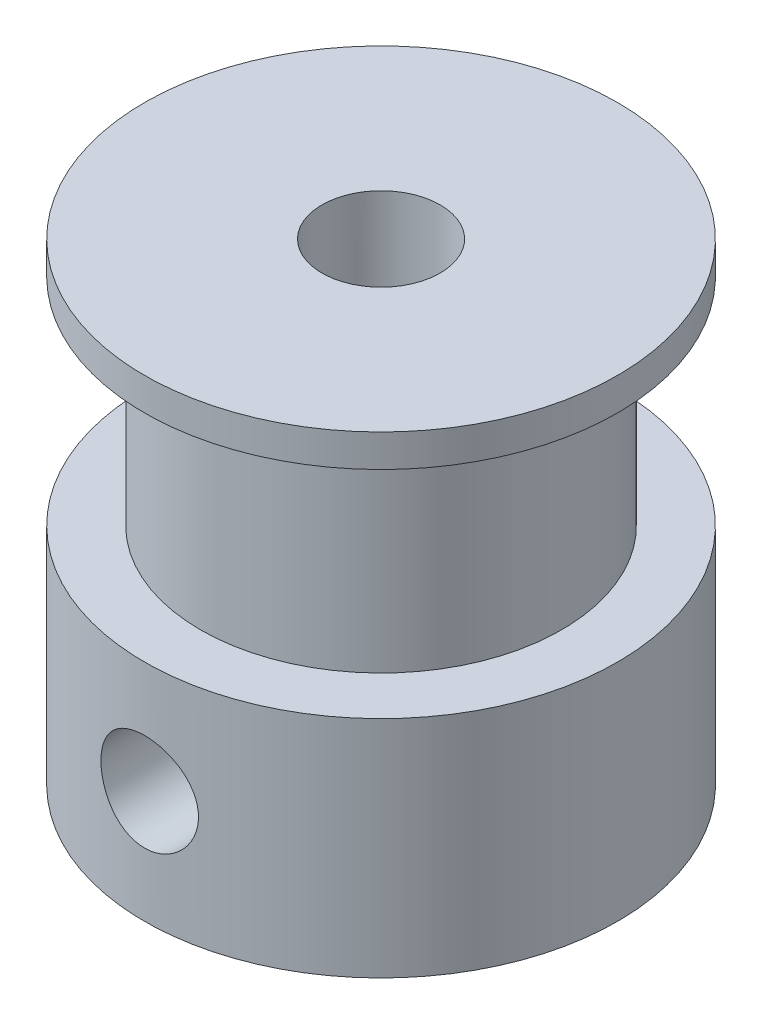
ISO-10303-21;
HEADER;
FILE_DESCRIPTION(('STEP AP214'),'2;1');
FILE_NAME('part.step','',(''),(''),'','','');
FILE_SCHEMA(('AUTOMOTIVE_DESIGN { 1 0 10303 214 1 1 1 1 }'));
ENDSEC;
DATA;
#1=APPLICATION_CONTEXT('core data for automotive mechanical design processes');
#2=APPLICATION_PROTOCOL_DEFINITION('international standard','automotive_design',2000,#1);
#3=PRODUCT_CONTEXT('',#1,'mechanical');
#4=PRODUCT('Part','Part','',(#3));
#5=PRODUCT_RELATED_PRODUCT_CATEGORY('part','',(#4));
#6=PRODUCT_DEFINITION_FORMATION('','',#4);
#7=PRODUCT_DEFINITION_CONTEXT('part definition',#1,'design');
#8=PRODUCT_DEFINITION('design','',#6,#7);
#9=PRODUCT_DEFINITION_SHAPE('','',#8);
#10=(LENGTH_UNIT() NAMED_UNIT(*) SI_UNIT(.MILLI.,.METRE.));
#11=(NAMED_UNIT(*) PLANE_ANGLE_UNIT() SI_UNIT($,.RADIAN.));
#12=(NAMED_UNIT(*) SI_UNIT($,.STERADIAN.) SOLID_ANGLE_UNIT());
#13=UNCERTAINTY_MEASURE_WITH_UNIT(LENGTH_MEASURE(1.E-05),#10,'distance_accuracy_value','');
#14=(GEOMETRIC_REPRESENTATION_CONTEXT(3) GLOBAL_UNCERTAINTY_ASSIGNED_CONTEXT((#13)) GLOBAL_UNIT_ASSIGNED_CONTEXT((#10,
#11,#12)) REPRESENTATION_CONTEXT('',''));
#15=CARTESIAN_POINT('',(0.,0.,0.));
#16=DIRECTION('',(0.,0.,1.));
#17=DIRECTION('',(1.,0.,0.));
#18=AXIS2_PLACEMENT_3D('',#15,#16,#17);
#19=CARTESIAN_POINT('',(0.,0.,0.));
#20=DIRECTION('',(0.,-1.,0.));
#21=DIRECTION('',(0.,0.,-1.));
#22=AXIS2_PLACEMENT_3D('',#19,#20,#21);
#23=CYLINDRICAL_SURFACE('',#22,2.);
#24=CARTESIAN_POINT('',(-1.13026545554573,3.8,-1.65));
#25=CARTESIAN_POINT('',(-1.13028415076943,3.85926051537599,-1.64999227227883));
#26=CARTESIAN_POINT('',(-1.13502591142918,3.918585815563,-1.64676945248434));
#27=CARTESIAN_POINT('',(-1.15304173822756,4.03532638305221,-1.63419783551532));
#28=CARTESIAN_POINT('',(-1.16634388013207,4.09273470909952,-1.62482887868409));
#29=CARTESIAN_POINT('',(-1.20547690344032,4.22556274774616,-1.59612095717539));
#30=CARTESIAN_POINT('',(-1.23414234516333,4.2995945923382,-1.57435275047642));
#31=CARTESIAN_POINT('',(-1.29806621774548,4.44149275037572,-1.52208388617206));
#32=CARTESIAN_POINT('',(-1.33334547250337,4.50933855545449,-1.49155548099388));
#33=CARTESIAN_POINT('',(-1.42222300183614,4.66663285325792,-1.40797644659791));
#34=CARTESIAN_POINT('',(-1.47726773224047,4.75311076059239,-1.35085848431609));
#35=CARTESIAN_POINT('',(-1.5861371945003,4.91436350952067,-1.22121270441164));
#36=CARTESIAN_POINT('',(-1.63996300247571,4.98914904795033,-1.14869911651516));
#37=CARTESIAN_POINT('',(-1.73075576686599,5.11121982813182,-1.00505161338099));
#38=CARTESIAN_POINT('',(-1.76889826123069,5.1609880474015,-0.936780316579709));
#39=CARTESIAN_POINT('',(-1.83869568986702,5.2505478516896,-0.791011905073765));
#40=CARTESIAN_POINT('',(-1.87036099924608,5.29035541481951,-0.713529863949439));
#41=CARTESIAN_POINT('',(-1.92003863633826,5.35219982846454,-0.564391365535739));
#42=CARTESIAN_POINT('',(-1.93945690667581,5.37610735426846,-0.493984239207893));
#43=CARTESIAN_POINT('',(-1.97070722627486,5.4144072664903,-0.348996465230121));
#44=CARTESIAN_POINT('',(-1.98254357394106,5.42880504439548,-0.274418208435071));
#45=CARTESIAN_POINT('',(-1.99768401570965,5.44720039950701,-0.122807668158569));
#46=CARTESIAN_POINT('',(-2.00095397094506,5.45115636437384,-0.0457668005088466));
#47=CARTESIAN_POINT('',(-1.99856235369188,5.44825734582013,0.1079694456252));
#48=CARTESIAN_POINT('',(-1.99290098652025,5.44140261092045,0.184664832010945));
#49=CARTESIAN_POINT('',(-1.97379671000669,5.41815118932709,0.3304385940908));
#50=CARTESIAN_POINT('',(-1.96087391985351,5.40239193125911,0.399690594450734));
#51=CARTESIAN_POINT('',(-1.92857757949744,5.36270411240553,0.534208242042524));
#52=CARTESIAN_POINT('',(-1.9092023171223,5.33877338326629,0.599472825762324));
#53=CARTESIAN_POINT('',(-1.86320785456576,5.28133933721514,0.730548464404965));
#54=CARTESIAN_POINT('',(-1.83609858158257,5.24717524760406,0.795894584928092));
#55=CARTESIAN_POINT('',(-1.77719394559291,5.17166899902193,0.919948391449341));
#56=CARTESIAN_POINT('',(-1.74539658935479,5.13032378551565,0.978653234921042));
#57=CARTESIAN_POINT('',(-1.67171963108471,5.03223815911382,1.10064828175204));
#58=CARTESIAN_POINT('',(-1.62911719465582,4.97408350097415,1.16236134200595));
#59=CARTESIAN_POINT('',(-1.54195911034385,4.84981509390737,1.27572706450586));
#60=CARTESIAN_POINT('',(-1.49740051200199,4.78368903987347,1.32736384220259));
#61=CARTESIAN_POINT('',(-1.41010644459443,4.64486141008404,1.41970811861179));
#62=CARTESIAN_POINT('',(-1.36735399521382,4.57226771702631,1.46056171573081));
#63=CARTESIAN_POINT('',(-1.28717415122903,4.41932117956903,1.53167497630218));
#64=CARTESIAN_POINT('',(-1.24973512700426,4.33898594768706,1.56195799486271));
#65=CARTESIAN_POINT('',(-1.1984152588373,4.20138882110026,1.60138777813433));
#66=CARTESIAN_POINT('',(-1.18093929490523,4.1465524002447,1.6142104205928));
#67=CARTESIAN_POINT('',(-1.15299719020701,4.03418814869539,1.63428776772427));
#68=CARTESIAN_POINT('',(-1.14251315468429,3.97666759493909,1.64155669328038));
#69=CARTESIAN_POINT('',(-1.13033953247814,3.85967800061025,1.64996891598047));
#70=CARTESIAN_POINT('',(-1.12872872011397,3.80019620842181,1.65105734680687));
#71=CARTESIAN_POINT('',(-1.13487333460963,3.6819297454341,1.64683678849177));
#72=CARTESIAN_POINT('',(-1.14263832831456,3.62314584859737,1.64152126492285));
#73=CARTESIAN_POINT('',(-1.16815617652571,3.49738797474651,1.62347982180047));
#74=CARTESIAN_POINT('',(-1.18749782996447,3.43092374216045,1.6095596982077));
#75=CARTESIAN_POINT('',(-1.23344854168307,3.30248437475811,1.57462287407046));
#76=CARTESIAN_POINT('',(-1.26008094126549,3.24052448092267,1.5535833287538));
#77=CARTESIAN_POINT('',(-1.33341951279276,3.08780902758391,1.49176915051823));
#78=CARTESIAN_POINT('',(-1.38303507818271,3.00027506187473,1.44653306326051));
#79=CARTESIAN_POINT('',(-1.48453519345396,2.83536695418688,1.34220157598673));
#80=CARTESIAN_POINT('',(-1.53642313229968,2.7580087270396,1.28308485952938));
#81=CARTESIAN_POINT('',(-1.63920566799775,2.61160568199577,1.14907243931511));
#82=CARTESIAN_POINT('',(-1.69001762335199,2.54289907872837,1.07373873685186));
#83=CARTESIAN_POINT('',(-1.78412887954789,2.41897772195684,0.908761283766789));
#84=CARTESIAN_POINT('',(-1.82745006163973,2.36372347309673,0.819160733032883));
#85=CARTESIAN_POINT('',(-1.89053568747178,2.28441263887737,0.656498289867193));
#86=CARTESIAN_POINT('',(-1.9134505711351,2.25598468797621,0.58678471759722));
#87=CARTESIAN_POINT('',(-1.95191365735138,2.20856628267004,0.442272815540217));
#88=CARTESIAN_POINT('',(-1.9674674713755,2.18956863883654,0.367478408864379));
#89=CARTESIAN_POINT('',(-1.990004906352,2.16211062191683,0.214253921939989));
#90=CARTESIAN_POINT('',(-1.99694128043541,2.1537083363002,0.13580622390241));
#91=CARTESIAN_POINT('',(-2.00143235704986,2.14826320041607,-0.0217524751306384));
#92=CARTESIAN_POINT('',(-1.99898891582435,2.1512181025879,-0.100863341794807));
#93=CARTESIAN_POINT('',(-1.98556597861725,2.16752022427639,-0.250369191143564));
#94=CARTESIAN_POINT('',(-1.97532813229727,2.17996465707949,-0.320934275077173));
#95=CARTESIAN_POINT('',(-1.94798026639519,2.21342517154411,-0.458585583525762));
#96=CARTESIAN_POINT('',(-1.93086923617685,2.23444251377738,-0.525671294793426));
#97=CARTESIAN_POINT('',(-1.88971965899813,2.28547626438997,-0.658860742236346));
#98=CARTESIAN_POINT('',(-1.86533788499696,2.31594257904114,-0.724683629772341));
#99=CARTESIAN_POINT('',(-1.81156976407853,2.38411779109453,-0.850229115075157));
#100=CARTESIAN_POINT('',(-1.78218001185953,2.42183161887149,-0.909947517441124));
#101=CARTESIAN_POINT('',(-1.70530487628979,2.52247411472445,-1.04922193468147));
#102=CARTESIAN_POINT('',(-1.65576344975117,2.58896913978808,-1.12507582112121));
#103=CARTESIAN_POINT('',(-1.55334758816822,2.73322626009445,-1.26272785048503));
#104=CARTESIAN_POINT('',(-1.50046569403278,2.81101411289381,-1.32449300754987));
#105=CARTESIAN_POINT('',(-1.40540519120628,2.9630051635957,-1.42433941767243));
#106=CARTESIAN_POINT('',(-1.36293689648538,3.03556470556712,-1.46466250238521));
#107=CARTESIAN_POINT('',(-1.28348372555566,3.18837493885839,-1.53474710964661));
#108=CARTESIAN_POINT('',(-1.24648383149605,3.2686035303686,-1.56453788297914));
#109=CARTESIAN_POINT('',(-1.19546064576473,3.40734324291319,-1.60359748989877));
#110=CARTESIAN_POINT('',(-1.1779352912953,3.46354399346197,-1.61639866033694));
#111=CARTESIAN_POINT('',(-1.15039619318333,3.57866767605502,-1.63611919687715));
#112=CARTESIAN_POINT('',(-1.14035358351031,3.63757920646891,-1.64306117976042));
#113=CARTESIAN_POINT('',(-1.13183426890592,3.73124345779533,-1.64892627372215));
#114=CARTESIAN_POINT('',(-1.13025460661204,3.7656108206252,-1.65000448443602));
#115=CARTESIAN_POINT('',(-1.13026545554573,3.8,-1.65));
#116=B_SPLINE_CURVE_WITH_KNOTS('',3,(#24,#25,#26,#27,#28,#29,#30,#31,#32,#33,#34,#35,#36,#37,
#38,#39,#40,#41,#42,#43,#44,#45,#46,#47,#48,#49,#50,#51,#52,#53,#54,#55,#56,#57,#58,#59,#60,#61,
#62,#63,#64,#65,#66,#67,#68,#69,#70,#71,#72,#73,#74,#75,#76,#77,#78,#79,#80,#81,#82,#83,#84,#85,
#86,#87,#88,#89,#90,#91,#92,#93,#94,#95,#96,#97,#98,#99,#100,#101,#102,#103,#104,#105,#106,#107,
#108,#109,#110,#111,#112,#113,#114,#115),.UNSPECIFIED.,.T.,.F.,(4,2,2,2,2,2,2,2,2,2,2,2,2,2,2,2,
2,2,2,2,2,2,2,2,2,2,2,2,2,2,2,2,2,2,2,2,2,2,2,2,2,2,2,2,2,4),(0.,0.177648530807623,
0.355882691473128,0.601443292499048,0.847790448623785,1.19812833957858,1.54814382224754,
1.82520592846372,2.10182070205136,2.33140490846503,2.5608588416851,2.79122581550894,
3.02158749363795,3.23723550442052,3.45294078334937,3.68777765164435,3.92271465497308,
4.20641290294695,4.49055483092938,4.77062243715899,5.05006727339435,5.2263891737602,
5.40225805582106,5.57968577284946,5.757294685913,5.96793121535144,6.17925014674008,
6.50847192127705,6.83820262620213,7.17830943304657,7.51740532680624,7.75256707833379,
7.98754927206169,8.2238141978469,8.46003236976818,8.67621339934492,8.89242622792675,
9.12113536240786,9.35000063862292,9.68537800220093,10.0215327023829,10.3004679621606,
10.5786223504854,10.7587522694697,10.9381836552402,11.0412740038956),.UNSPECIFIED.);
#117=CARTESIAN_POINT('',(-1.4142135623731,2.95000000000001,1.41421356237309));
#118=VERTEX_POINT('',#117);
#119=CARTESIAN_POINT('',(-1.41421356237344,4.65000000000007,1.41421356237275));
#120=VERTEX_POINT('',#119);
#121=EDGE_CURVE('E47',#118,#120,#116,.T.);
#122=ORIENTED_EDGE('',*,*,#121,.F.);
#123=CARTESIAN_POINT('',(-1.65,3.8,1.13026545554573));
#124=CARTESIAN_POINT('',(-1.64999227227882,3.85926051537599,1.13028415076944));
#125=CARTESIAN_POINT('',(-1.64676945248434,3.918585815563,1.13502591142918));
#126=CARTESIAN_POINT('',(-1.63419783551532,4.03532638305221,1.15304173822756));
#127=CARTESIAN_POINT('',(-1.62482887868409,4.09273470909952,1.16634388013208));
#128=CARTESIAN_POINT('',(-1.59612095717538,4.22556274774616,1.20547690344032));
#129=CARTESIAN_POINT('',(-1.57435275047642,4.2995945923382,1.23414234516333));
#130=CARTESIAN_POINT('',(-1.52208388617206,4.44149275037572,1.29806621774548));
#131=CARTESIAN_POINT('',(-1.49155548099387,4.50933855545449,1.33334547250337));
#132=CARTESIAN_POINT('',(-1.4079764465979,4.66663285325792,1.42222300183615));
#133=CARTESIAN_POINT('',(-1.35085848431608,4.75311076059239,1.47726773224047));
#134=CARTESIAN_POINT('',(-1.22121270441163,4.91436350952067,1.5861371945003));
#135=CARTESIAN_POINT('',(-1.14869911651515,4.98914904795033,1.63996300247571));
#136=CARTESIAN_POINT('',(-1.00505161338098,5.11121982813182,1.73075576686599));
#137=CARTESIAN_POINT('',(-0.936780316579703,5.1609880474015,1.76889826123069));
#138=CARTESIAN_POINT('',(-0.791011905073759,5.2505478516896,1.83869568986702));
#139=CARTESIAN_POINT('',(-0.713529863949433,5.29035541481951,1.87036099924608));
#140=CARTESIAN_POINT('',(-0.564391365535732,5.35219982846454,1.92003863633826));
#141=CARTESIAN_POINT('',(-0.493984239207887,5.37610735426846,1.93945690667581));
#142=CARTESIAN_POINT('',(-0.348996465230114,5.41440726649029,1.97070722627487));
#143=CARTESIAN_POINT('',(-0.274418208435065,5.42880504439548,1.98254357394106));
#144=CARTESIAN_POINT('',(-0.122807668158563,5.44720039950702,1.99768401570965));
#145=CARTESIAN_POINT('',(-0.0457668005088398,5.45115636437384,2.00095397094506));
#146=CARTESIAN_POINT('',(0.107969445625207,5.44825734582013,1.99856235369188));
#147=CARTESIAN_POINT('',(0.184664832010951,5.44140261092045,1.99290098652025));
#148=CARTESIAN_POINT('',(0.330438594090807,5.41815118932709,1.97379671000668));
#149=CARTESIAN_POINT('',(0.39969059445074,5.40239193125911,1.96087391985351));
#150=CARTESIAN_POINT('',(0.53420824204253,5.36270411240553,1.92857757949744));
#151=CARTESIAN_POINT('',(0.59947282576233,5.33877338326629,1.9092023171223));
#152=CARTESIAN_POINT('',(0.730548464404971,5.28133933721514,1.86320785456575));
#153=CARTESIAN_POINT('',(0.795894584928098,5.24717524760406,1.83609858158257));
#154=CARTESIAN_POINT('',(0.919948391449347,5.17166899902193,1.7771939455929));
#155=CARTESIAN_POINT('',(0.978653234921048,5.13032378551565,1.74539658935478));
#156=CARTESIAN_POINT('',(1.10064828175205,5.03223815911382,1.6717196310847));
#157=CARTESIAN_POINT('',(1.16236134200595,4.97408350097415,1.62911719465582));
#158=CARTESIAN_POINT('',(1.27572706450587,4.84981509390737,1.54195911034385));
#159=CARTESIAN_POINT('',(1.32736384220259,4.78368903987347,1.49740051200199));
#160=CARTESIAN_POINT('',(1.4197081186118,4.64486141008404,1.41010644459443));
#161=CARTESIAN_POINT('',(1.46056171573082,4.57226771702631,1.36735399521382));
#162=CARTESIAN_POINT('',(1.53167497630219,4.41932117956903,1.28717415122902));
#163=CARTESIAN_POINT('',(1.56195799486271,4.33898594768706,1.24973512700425));
#164=CARTESIAN_POINT('',(1.60138777813434,4.20138882110026,1.19841525883729));
#165=CARTESIAN_POINT('',(1.6142104205928,4.1465524002447,1.18093929490522));
#166=CARTESIAN_POINT('',(1.63428776772427,4.03418814869539,1.15299719020701));
#167=CARTESIAN_POINT('',(1.64155669328038,3.97666759493909,1.14251315468429));
#168=CARTESIAN_POINT('',(1.64996891598048,3.85967800061025,1.13033953247814));
#169=CARTESIAN_POINT('',(1.65105734680687,3.80019620842181,1.12872872011396));
#170=CARTESIAN_POINT('',(1.64683678849177,3.6819297454341,1.13487333460963));
#171=CARTESIAN_POINT('',(1.64152126492285,3.62314584859737,1.14263832831455));
#172=CARTESIAN_POINT('',(1.62347982180047,3.49738797474651,1.1681561765257));
#173=CARTESIAN_POINT('',(1.6095596982077,3.43092374216045,1.18749782996446));
#174=CARTESIAN_POINT('',(1.57462287407046,3.30248437475811,1.23344854168307));
#175=CARTESIAN_POINT('',(1.5535833287538,3.24052448092267,1.26008094126548));
#176=CARTESIAN_POINT('',(1.49176915051823,3.08780902758391,1.33341951279275));
#177=CARTESIAN_POINT('',(1.44653306326052,3.00027506187473,1.3830350781827));
#178=CARTESIAN_POINT('',(1.34220157598674,2.83536695418688,1.48453519345396));
#179=CARTESIAN_POINT('',(1.28308485952939,2.7580087270396,1.53642313229967));
#180=CARTESIAN_POINT('',(1.14907243931511,2.61160568199577,1.63920566799775));
#181=CARTESIAN_POINT('',(1.07373873685187,2.54289907872837,1.69001762335199));
#182=CARTESIAN_POINT('',(0.908761283766796,2.41897772195684,1.78412887954789));
#183=CARTESIAN_POINT('',(0.81916073303289,2.36372347309673,1.82745006163973));
#184=CARTESIAN_POINT('',(0.656498289867201,2.28441263887737,1.89053568747177));
#185=CARTESIAN_POINT('',(0.586784717597228,2.25598468797621,1.9134505711351));
#186=CARTESIAN_POINT('',(0.442272815540226,2.20856628267004,1.95191365735137));
#187=CARTESIAN_POINT('',(0.367478408864387,2.18956863883654,1.9674674713755));
#188=CARTESIAN_POINT('',(0.214253921939997,2.16211062191683,1.990004906352));
#189=CARTESIAN_POINT('',(0.135806223902418,2.1537083363002,1.99694128043541));
#190=CARTESIAN_POINT('',(-0.0217524751306306,2.14826320041607,2.00143235704986));
#191=CARTESIAN_POINT('',(-0.100863341794799,2.1512181025879,1.99898891582435));
#192=CARTESIAN_POINT('',(-0.250369191143556,2.16752022427639,1.98556597861726));
#193=CARTESIAN_POINT('',(-0.320934275077165,2.17996465707949,1.97532813229727));
#194=CARTESIAN_POINT('',(-0.458585583525754,2.21342517154411,1.94798026639519));
#195=CARTESIAN_POINT('',(-0.525671294793418,2.23444251377738,1.93086923617685));
#196=CARTESIAN_POINT('',(-0.658860742236339,2.28547626438997,1.88971965899813));
#197=CARTESIAN_POINT('',(-0.724683629772334,2.31594257904114,1.86533788499697));
#198=CARTESIAN_POINT('',(-0.85022911507515,2.38411779109453,1.81156976407853));
#199=CARTESIAN_POINT('',(-0.909947517441117,2.42183161887149,1.78218001185953));
#200=CARTESIAN_POINT('',(-1.04922193468147,2.52247411472445,1.70530487628979));
#201=CARTESIAN_POINT('',(-1.1250758211212,2.58896913978807,1.65576344975117));
#202=CARTESIAN_POINT('',(-1.26272785048503,2.73322626009445,1.55334758816822));
#203=CARTESIAN_POINT('',(-1.32449300754986,2.81101411289381,1.50046569403278));
#204=CARTESIAN_POINT('',(-1.42433941767242,2.9630051635957,1.40540519120628));
#205=CARTESIAN_POINT('',(-1.4646625023852,3.03556470556712,1.36293689648538));
#206=CARTESIAN_POINT('',(-1.5347471096466,3.18837493885839,1.28348372555566));
#207=CARTESIAN_POINT('',(-1.56453788297913,3.2686035303686,1.24648383149606));
#208=CARTESIAN_POINT('',(-1.60359748989877,3.40734324291319,1.19546064576473));
#209=CARTESIAN_POINT('',(-1.61639866033694,3.46354399346197,1.1779352912953));
#210=CARTESIAN_POINT('',(-1.63611919687715,3.57866767605502,1.15039619318334));
#211=CARTESIAN_POINT('',(-1.64306117976041,3.63757920646891,1.14035358351031));
#212=CARTESIAN_POINT('',(-1.64892627372214,3.73124345779533,1.13183426890593));
#213=CARTESIAN_POINT('',(-1.65000448443602,3.7656108206252,1.13025460661205));
#214=CARTESIAN_POINT('',(-1.65,3.8,1.13026545554573));
#215=B_SPLINE_CURVE_WITH_KNOTS('',3,(#123,#124,#125,#126,#127,#128,#129,#130,#131,#132,#133,
#134,#135,#136,#137,#138,#139,#140,#141,#142,#143,#144,#145,#146,#147,#148,#149,#150,#151,#152,
#153,#154,#155,#156,#157,#158,#159,#160,#161,#162,#163,#164,#165,#166,#167,#168,#169,#170,#171,
#172,#173,#174,#175,#176,#177,#178,#179,#180,#181,#182,#183,#184,#185,#186,#187,#188,#189,#190,
#191,#192,#193,#194,#195,#196,#197,#198,#199,#200,#201,#202,#203,#204,#205,#206,#207,#208,#209,
#210,#211,#212,#213,#214),.UNSPECIFIED.,.T.,.F.,(4,2,2,2,2,2,2,2,2,2,2,2,2,2,2,2,2,2,2,2,2,2,2,
2,2,2,2,2,2,2,2,2,2,2,2,2,2,2,2,2,2,2,2,2,2,4),(0.,0.177648530807623,0.355882691473128,
0.601443292499048,0.847790448623785,1.19812833957858,1.54814382224754,1.82520592846372,
2.10182070205136,2.33140490846503,2.5608588416851,2.79122581550894,3.02158749363795,
3.23723550442052,3.45294078334937,3.68777765164435,3.92271465497308,4.20641290294695,
4.49055483092938,4.77062243715899,5.05006727339436,5.2263891737602,5.40225805582106,
5.57968577284946,5.757294685913,5.96793121535144,6.17925014674009,6.50847192127705,
6.83820262620213,7.17830943304658,7.51740532680624,7.75256707833379,7.98754927206169,
8.2238141978469,8.46003236976818,8.67621339934493,8.89242622792676,9.12113536240787,
9.35000063862292,9.68537800220093,10.0215327023829,10.3004679621606,10.5786223504854,
10.7587522694697,10.9381836552402,11.0412740038956),.UNSPECIFIED.);
#216=EDGE_CURVE('E54',#120,#118,#215,.T.);
#217=ORIENTED_EDGE('',*,*,#216,.F.);
#218=EDGE_LOOP('',(#122,#217));
#219=FACE_BOUND('',#218,.T.);
#220=CARTESIAN_POINT('',(0.,0.,0.));
#221=DIRECTION('',(0.,-1.,0.));
#222=DIRECTION('',(0.,0.,-1.));
#223=AXIS2_PLACEMENT_3D('',#220,#221,#222);
#224=CIRCLE('',#223,2.);
#225=CARTESIAN_POINT('',(0.,0.,-2.));
#226=VERTEX_POINT('',#225);
#227=EDGE_CURVE('E59',#226,#226,#224,.T.);
#228=ORIENTED_EDGE('',*,*,#227,.T.);
#229=EDGE_LOOP('',(#228));
#230=FACE_BOUND('',#229,.T.);
#231=CARTESIAN_POINT('',(0.,16.,0.));
#232=DIRECTION('',(0.,-1.,0.));
#233=DIRECTION('',(0.,0.,-1.));
#234=AXIS2_PLACEMENT_3D('',#231,#232,#233);
#235=CIRCLE('',#234,2.);
#236=CARTESIAN_POINT('',(0.,16.,-2.));
#237=VERTEX_POINT('',#236);
#238=EDGE_CURVE('E87',#237,#237,#235,.T.);
#239=ORIENTED_EDGE('',*,*,#238,.F.);
#240=EDGE_LOOP('',(#239));
#241=FACE_BOUND('',#240,.T.);
#242=ADVANCED_FACE('F33',(#219,#230,#241),#23,.F.);
#243=CARTESIAN_POINT('',(2.,16.,0.));
#244=DIRECTION('',(0.,1.,0.));
#245=DIRECTION('',(0.,0.,1.));
#246=AXIS2_PLACEMENT_3D('',#243,#244,#245);
#247=PLANE('',#246);
#248=ORIENTED_EDGE('',*,*,#238,.T.);
#249=EDGE_LOOP('',(#248));
#250=FACE_BOUND('',#249,.T.);
#251=CARTESIAN_POINT('',(0.,16.,0.));
#252=DIRECTION('',(0.,-1.,0.));
#253=DIRECTION('',(0.,0.,-1.));
#254=AXIS2_PLACEMENT_3D('',#251,#252,#253);
#255=CIRCLE('',#254,8.);
#256=CARTESIAN_POINT('',(0.,16.,-8.));
#257=VERTEX_POINT('',#256);
#258=EDGE_CURVE('E121',#257,#257,#255,.T.);
#259=ORIENTED_EDGE('',*,*,#258,.F.);
#260=EDGE_LOOP('',(#259));
#261=FACE_BOUND('',#260,.T.);
#262=ADVANCED_FACE('F109',(#250,#261),#247,.T.);
#263=CARTESIAN_POINT('',(0.,0.,0.));
#264=DIRECTION('',(0.,-1.,0.));
#265=DIRECTION('',(0.,0.,-1.));
#266=AXIS2_PLACEMENT_3D('',#263,#264,#265);
#267=CYLINDRICAL_SURFACE('',#266,8.);
#268=ORIENTED_EDGE('',*,*,#258,.T.);
#269=EDGE_LOOP('',(#268));
#270=FACE_BOUND('',#269,.T.);
#271=CARTESIAN_POINT('',(0.,14.9,0.));
#272=DIRECTION('',(0.,-1.,0.));
#273=DIRECTION('',(0.,0.,-1.));
#274=AXIS2_PLACEMENT_3D('',#271,#272,#273);
#275=CIRCLE('',#274,8.);
#276=CARTESIAN_POINT('',(0.,14.9,-8.));
#277=VERTEX_POINT('',#276);
#278=EDGE_CURVE('E122',#277,#277,#275,.T.);
#279=ORIENTED_EDGE('',*,*,#278,.F.);
#280=EDGE_LOOP('',(#279));
#281=FACE_BOUND('',#280,.T.);
#282=ADVANCED_FACE('F106',(#270,#281),#267,.T.);
#283=CARTESIAN_POINT('',(8.,14.9,0.));
#284=DIRECTION('',(0.,-1.,0.));
#285=DIRECTION('',(0.,0.,-1.));
#286=AXIS2_PLACEMENT_3D('',#283,#284,#285);
#287=PLANE('',#286);
#288=ORIENTED_EDGE('',*,*,#278,.T.);
#289=EDGE_LOOP('',(#288));
#290=FACE_BOUND('',#289,.T.);
#291=CARTESIAN_POINT('',(0.,14.9,0.));
#292=DIRECTION('',(0.,-1.,0.));
#293=DIRECTION('',(0.,0.,-1.));
#294=AXIS2_PLACEMENT_3D('',#291,#292,#293);
#295=CIRCLE('',#294,6.11);
#296=CARTESIAN_POINT('',(0.,14.9,-6.11));
#297=VERTEX_POINT('',#296);
#298=EDGE_CURVE('E124',#297,#297,#295,.T.);
#299=ORIENTED_EDGE('',*,*,#298,.F.);
#300=EDGE_LOOP('',(#299));
#301=FACE_BOUND('',#300,.T.);
#302=ADVANCED_FACE('F102',(#290,#301),#287,.T.);
#303=CARTESIAN_POINT('',(0.,0.,0.));
#304=DIRECTION('',(0.,-1.,0.));
#305=DIRECTION('',(0.,0.,-1.));
#306=AXIS2_PLACEMENT_3D('',#303,#304,#305);
#307=CYLINDRICAL_SURFACE('',#306,6.11);
#308=ORIENTED_EDGE('',*,*,#298,.T.);
#309=EDGE_LOOP('',(#308));
#310=FACE_BOUND('',#309,.T.);
#311=CARTESIAN_POINT('',(0.,7.6,0.));
#312=DIRECTION('',(0.,-1.,0.));
#313=DIRECTION('',(0.,0.,-1.));
#314=AXIS2_PLACEMENT_3D('',#311,#312,#313);
#315=CIRCLE('',#314,6.11);
#316=CARTESIAN_POINT('',(0.,7.6,-6.11));
#317=VERTEX_POINT('',#316);
#318=EDGE_CURVE('E129',#317,#317,#315,.T.);
#319=ORIENTED_EDGE('',*,*,#318,.F.);
#320=EDGE_LOOP('',(#319));
#321=FACE_BOUND('',#320,.T.);
#322=ADVANCED_FACE('F98',(#310,#321),#307,.T.);
#323=CARTESIAN_POINT('',(6.11,7.6,0.));
#324=DIRECTION('',(0.,1.,0.));
#325=DIRECTION('',(0.,0.,1.));
#326=AXIS2_PLACEMENT_3D('',#323,#324,#325);
#327=PLANE('',#326);
#328=ORIENTED_EDGE('',*,*,#318,.T.);
#329=EDGE_LOOP('',(#328));
#330=FACE_BOUND('',#329,.T.);
#331=CARTESIAN_POINT('',(0.,7.6,0.));
#332=DIRECTION('',(0.,-1.,0.));
#333=DIRECTION('',(0.,0.,-1.));
#334=AXIS2_PLACEMENT_3D('',#331,#332,#333);
#335=CIRCLE('',#334,8.);
#336=CARTESIAN_POINT('',(0.,7.6,-8.));
#337=VERTEX_POINT('',#336);
#338=EDGE_CURVE('E132',#337,#337,#335,.T.);
#339=ORIENTED_EDGE('',*,*,#338,.F.);
#340=EDGE_LOOP('',(#339));
#341=FACE_BOUND('',#340,.T.);
#342=ADVANCED_FACE('F93',(#330,#341),#327,.T.);
#343=CARTESIAN_POINT('',(0.,0.,0.));
#344=DIRECTION('',(0.,-1.,0.));
#345=DIRECTION('',(0.,0.,-1.));
#346=AXIS2_PLACEMENT_3D('',#343,#344,#345);
#347=CYLINDRICAL_SURFACE('',#346,8.);
#348=CARTESIAN_POINT('',(-8.,2.15,0.));
#349=CARTESIAN_POINT('',(-7.99999830466001,2.15000329709781,0.0916407195420934));
#350=CARTESIAN_POINT('',(-7.99840926134725,2.15766035518844,0.183322508381963));
#351=CARTESIAN_POINT('',(-7.99222359173557,2.18805953567185,0.364090486799869));
#352=CARTESIAN_POINT('',(-7.98762465402597,2.21081325153873,0.453174626582991));
#353=CARTESIAN_POINT('',(-7.97593225373362,2.2706696077264,0.626107937761365));
#354=CARTESIAN_POINT('',(-7.96884125176521,2.30775809776896,0.709962177239543));
#355=CARTESIAN_POINT('',(-7.95293377965832,2.39518820033906,0.870252949930878));
#356=CARTESIAN_POINT('',(-7.94411739325113,2.44552916977707,0.946689842831774));
#357=CARTESIAN_POINT('',(-7.92558648672407,2.55880106297352,1.09107850067234));
#358=CARTESIAN_POINT('',(-7.91586187136437,2.6218856235408,1.15890845453255));
#359=CARTESIAN_POINT('',(-7.89668321805648,2.7585238287823,1.28310256116969));
#360=CARTESIAN_POINT('',(-7.88722920223015,2.83207832646763,1.33946577881405));
#361=CARTESIAN_POINT('',(-7.86956329469156,2.98845261124896,1.439651100932));
#362=CARTESIAN_POINT('',(-7.86136437560847,3.07135554051845,1.4833459234654));
#363=CARTESIAN_POINT('',(-7.84728086241899,3.24352376346136,1.55613837443198));
#364=CARTESIAN_POINT('',(-7.84139602426694,3.33278838504981,1.58523754222912));
#365=CARTESIAN_POINT('',(-7.83270934672408,3.51383194999834,1.62761489438168));
#366=CARTESIAN_POINT('',(-7.82986577646947,3.60555867318197,1.6411074411271));
#367=CARTESIAN_POINT('',(-7.82745807970268,3.79001455100845,1.65255460798118));
#368=CARTESIAN_POINT('',(-7.82789359605779,3.88274359538779,1.65051092017593));
#369=CARTESIAN_POINT('',(-7.83195699249659,4.06499542508166,1.63111668222377));
#370=CARTESIAN_POINT('',(-7.8355333998161,4.15454579230345,1.61401292403969));
#371=CARTESIAN_POINT('',(-7.84539445259546,4.32947813147746,1.56537407698976));
#372=CARTESIAN_POINT('',(-7.85167923477146,4.41485989276023,1.53383825960254));
#373=CARTESIAN_POINT('',(-7.86630090751808,4.57973690269178,1.45699777917217));
#374=CARTESIAN_POINT('',(-7.8746521540866,4.65918568076121,1.41159624906001));
#375=CARTESIAN_POINT('',(-7.89245670014424,4.80942921254007,1.30838139442337));
#376=CARTESIAN_POINT('',(-7.90191013391075,4.88022290966056,1.25056655688556));
#377=CARTESIAN_POINT('',(-7.9210761919093,5.0125697392375,1.1228497299196));
#378=CARTESIAN_POINT('',(-7.93079031160689,5.0739198087456,1.05273735419362));
#379=CARTESIAN_POINT('',(-7.94921762583845,5.18402151702538,0.903112309957801));
#380=CARTESIAN_POINT('',(-7.95793080592347,5.2327729739438,0.823599505782668));
#381=CARTESIAN_POINT('',(-7.97339804723506,5.31633520611298,0.657197902062795));
#382=CARTESIAN_POINT('',(-7.98014868624195,5.35112166937483,0.570296555511015));
#383=CARTESIAN_POINT('',(-7.99090445204566,5.40554403083058,0.391712622109054));
#384=CARTESIAN_POINT('',(-7.99490993294788,5.42518188312591,0.300030653566663));
#385=CARTESIAN_POINT('',(-7.99967440549744,5.44845954083967,0.116231946363129));
#386=CARTESIAN_POINT('',(-8.00048974989202,5.45237707288145,0.0241517979908426));
#387=CARTESIAN_POINT('',(-7.998939058222,5.44485239834094,-0.15934726467908));
#388=CARTESIAN_POINT('',(-7.99657321289569,5.43341111264522,-0.250766218290332));
#389=CARTESIAN_POINT('',(-7.98896133117211,5.39572418712627,-0.429444014904605));
#390=CARTESIAN_POINT('',(-7.98374323165773,5.36962207793282,-0.516734426475131));
#391=CARTESIAN_POINT('',(-7.97101009225547,5.30351209172606,-0.685699095825393));
#392=CARTESIAN_POINT('',(-7.96349487230839,5.2635031245935,-0.767372912734803));
#393=CARTESIAN_POINT('',(-7.94686114142078,5.17012152443816,-0.92394986045281));
#394=CARTESIAN_POINT('',(-7.93772318016806,5.11658299644491,-0.998751941729507));
#395=CARTESIAN_POINT('',(-7.91890127310842,4.99788296043954,-1.13840995014654));
#396=CARTESIAN_POINT('',(-7.90921726486105,4.93272012133686,-1.20326473664671));
#397=CARTESIAN_POINT('',(-7.89020322125625,4.79135347486465,-1.32226758953255));
#398=CARTESIAN_POINT('',(-7.88088150077533,4.71498738366169,-1.37622443804953));
#399=CARTESIAN_POINT('',(-7.86382860657072,4.5541130800352,-1.47054630126101));
#400=CARTESIAN_POINT('',(-7.85609736723785,4.46960520368098,-1.510911876655));
#401=CARTESIAN_POINT('',(-7.84316897738331,4.29528280762361,-1.5766496514886));
#402=CARTESIAN_POINT('',(-7.83795830360761,4.20549957210841,-1.60210202195354));
#403=CARTESIAN_POINT('',(-7.83063366117499,4.02281096657222,-1.63753157889192));
#404=CARTESIAN_POINT('',(-7.82851925954992,3.92990603493349,-1.64751092905128));
#405=CARTESIAN_POINT('',(-7.82765166523675,3.74553365991803,-1.65162714556421));
#406=CARTESIAN_POINT('',(-7.82883429816181,3.65407313863624,-1.64606648188567));
#407=CARTESIAN_POINT('',(-7.83428356728563,3.4734215755253,-1.6199308780128));
#408=CARTESIAN_POINT('',(-7.83855017513693,3.38423051284341,-1.59935607582627));
#409=CARTESIAN_POINT('',(-7.84965710898136,3.21085765152226,-1.54391487276416));
#410=CARTESIAN_POINT('',(-7.85649034513221,3.12666278697603,-1.50908781763041));
#411=CARTESIAN_POINT('',(-7.87196421207747,2.96526468478972,-1.42616638770596));
#412=CARTESIAN_POINT('',(-7.88060500656397,2.88806208127521,-1.37807081119507));
#413=CARTESIAN_POINT('',(-7.89891524219782,2.74133870150495,-1.26895419649465));
#414=CARTESIAN_POINT('',(-7.90860042776133,2.67198162603548,-1.2077156398922));
#415=CARTESIAN_POINT('',(-7.9277975660215,2.54442834587936,-1.07449788612552));
#416=CARTESIAN_POINT('',(-7.93730947834751,2.48623471279036,-1.00251622096495));
#417=CARTESIAN_POINT('',(-7.95521487654737,2.38203856905719,-0.848880613767922));
#418=CARTESIAN_POINT('',(-7.96359456503878,2.33618068748797,-0.767126900915515));
#419=CARTESIAN_POINT('',(-7.97815479541984,2.25892786004803,-0.596921258332664));
#420=CARTESIAN_POINT('',(-7.98433727409232,2.22752016948178,-0.508475311474893));
#421=CARTESIAN_POINT('',(-7.99263694073891,2.18598583861668,-0.349887562280652));
#422=CARTESIAN_POINT('',(-7.99538162684993,2.17251574674514,-0.280634724618724));
#423=CARTESIAN_POINT('',(-7.99906377620171,2.15452171892964,-0.140929326188185));
#424=CARTESIAN_POINT('',(-8.00000130381071,2.14999746434848,-0.0704768082405311));
#425=CARTESIAN_POINT('',(-8.,2.15,0.));
#426=B_SPLINE_CURVE_WITH_KNOTS('',3,(#348,#349,#350,#351,#352,#353,#354,#355,#356,#357,#358,
#359,#360,#361,#362,#363,#364,#365,#366,#367,#368,#369,#370,#371,#372,#373,#374,#375,#376,#377,
#378,#379,#380,#381,#382,#383,#384,#385,#386,#387,#388,#389,#390,#391,#392,#393,#394,#395,#396,
#397,#398,#399,#400,#401,#402,#403,#404,#405,#406,#407,#408,#409,#410,#411,#412,#413,#414,#415,
#416,#417,#418,#419,#420,#421,#422,#423,#424,#425),.UNSPECIFIED.,.T.,.F.,(4,2,2,2,2,2,2,2,2,2,2,
2,2,2,2,2,2,2,2,2,2,2,2,2,2,2,2,2,2,2,2,2,2,2,2,2,2,2,4),(0.,0.274664286133512,
0.549539745146944,0.824144556648048,1.09873604513759,1.37686012616531,1.65500687961843,
1.93585838646539,2.21668026643688,2.49359735724628,2.77048428882733,3.04291655166271,
3.31536256822658,3.58975722869535,3.86418535314677,4.14387209364693,4.42356287102888,
4.70373847885486,4.98387793926425,5.25904586820427,5.53419729931631,5.80670078626852,
6.0792256388171,6.35526963287411,6.63134525682185,6.91190943522957,7.19246203771847,
7.47149225790371,7.7504834560871,8.02408241270319,8.29767885446865,8.57052502859215,
8.84339592230944,9.12118929442838,9.39904658206426,9.68003210657614,9.96076933178316,
10.1720089623927,10.3832410688304),.UNSPECIFIED.);
#427=CARTESIAN_POINT('',(-8.,2.15,0.));
#428=VERTEX_POINT('',#427);
#429=EDGE_CURVE('E55',#428,#428,#426,.T.);
#430=ORIENTED_EDGE('',*,*,#429,.F.);
#431=EDGE_LOOP('',(#430));
#432=FACE_BOUND('',#431,.T.);
#433=CARTESIAN_POINT('',(0.,2.15,8.));
#434=CARTESIAN_POINT('',(0.0916407195421213,2.15000329709781,7.99999830466001));
#435=CARTESIAN_POINT('',(0.183322508381991,2.15766035518844,7.99840926134725));
#436=CARTESIAN_POINT('',(0.364090486799897,2.18805953567185,7.99222359173557));
#437=CARTESIAN_POINT('',(0.453174626583019,2.21081325153873,7.98762465402597));
#438=CARTESIAN_POINT('',(0.626107937761393,2.2706696077264,7.97593225373361));
#439=CARTESIAN_POINT('',(0.70996217723957,2.30775809776896,7.96884125176521));
#440=CARTESIAN_POINT('',(0.870252949930906,2.39518820033906,7.95293377965832));
#441=CARTESIAN_POINT('',(0.946689842831802,2.44552916977707,7.94411739325113));
#442=CARTESIAN_POINT('',(1.09107850067236,2.55880106297352,7.92558648672407));
#443=CARTESIAN_POINT('',(1.15890845453257,2.6218856235408,7.91586187136436));
#444=CARTESIAN_POINT('',(1.28310256116972,2.7585238287823,7.89668321805648));
#445=CARTESIAN_POINT('',(1.33946577881408,2.83207832646763,7.88722920223015));
#446=CARTESIAN_POINT('',(1.43965110093203,2.98845261124896,7.86956329469155));
#447=CARTESIAN_POINT('',(1.48334592346543,3.07135554051845,7.86136437560846));
#448=CARTESIAN_POINT('',(1.556138374432,3.24352376346136,7.84728086241899));
#449=CARTESIAN_POINT('',(1.58523754222915,3.33278838504981,7.84139602426694));
#450=CARTESIAN_POINT('',(1.6276148943817,3.51383194999834,7.83270934672408));
#451=CARTESIAN_POINT('',(1.64110744112713,3.60555867318197,7.82986577646946));
#452=CARTESIAN_POINT('',(1.65255460798121,3.79001455100845,7.82745807970267));
#453=CARTESIAN_POINT('',(1.65051092017596,3.88274359538779,7.82789359605778));
#454=CARTESIAN_POINT('',(1.6311166822238,4.06499542508166,7.83195699249659));
#455=CARTESIAN_POINT('',(1.61401292403972,4.15454579230345,7.8355333998161));
#456=CARTESIAN_POINT('',(1.56537407698979,4.32947813147746,7.84539445259546));
#457=CARTESIAN_POINT('',(1.53383825960257,4.41485989276023,7.85167923477145));
#458=CARTESIAN_POINT('',(1.4569977791722,4.57973690269178,7.86630090751808));
#459=CARTESIAN_POINT('',(1.41159624906003,4.65918568076121,7.8746521540866));
#460=CARTESIAN_POINT('',(1.3083813944234,4.80942921254007,7.89245670014424));
#461=CARTESIAN_POINT('',(1.25056655688558,4.88022290966056,7.90191013391074));
#462=CARTESIAN_POINT('',(1.12284972991962,5.0125697392375,7.92107619190929));
#463=CARTESIAN_POINT('',(1.05273735419364,5.0739198087456,7.93079031160688));
#464=CARTESIAN_POINT('',(0.903112309957829,5.18402151702539,7.94921762583845));
#465=CARTESIAN_POINT('',(0.823599505782696,5.2327729739438,7.95793080592347));
#466=CARTESIAN_POINT('',(0.657197902062823,5.31633520611298,7.97339804723506));
#467=CARTESIAN_POINT('',(0.570296555511042,5.35112166937483,7.98014868624195));
#468=CARTESIAN_POINT('',(0.391712622109082,5.40554403083058,7.99090445204566));
#469=CARTESIAN_POINT('',(0.300030653566691,5.42518188312591,7.99490993294788));
#470=CARTESIAN_POINT('',(0.116231946363157,5.44845954083967,7.99967440549744));
#471=CARTESIAN_POINT('',(0.024151797990871,5.45237707288145,8.00048974989202));
#472=CARTESIAN_POINT('',(-0.159347264679051,5.44485239834094,7.998939058222));
#473=CARTESIAN_POINT('',(-0.250766218290304,5.43341111264522,7.99657321289569));
#474=CARTESIAN_POINT('',(-0.429444014904577,5.39572418712627,7.98896133117211));
#475=CARTESIAN_POINT('',(-0.516734426475103,5.36962207793282,7.98374323165773));
#476=CARTESIAN_POINT('',(-0.685699095825365,5.30351209172606,7.97101009225547));
#477=CARTESIAN_POINT('',(-0.767372912734775,5.2635031245935,7.96349487230839));
#478=CARTESIAN_POINT('',(-0.923949860452783,5.17012152443816,7.94686114142079));
#479=CARTESIAN_POINT('',(-0.998751941729479,5.11658299644491,7.93772318016806));
#480=CARTESIAN_POINT('',(-1.13840995014652,4.99788296043954,7.91890127310843));
#481=CARTESIAN_POINT('',(-1.20326473664668,4.93272012133686,7.90921726486106));
#482=CARTESIAN_POINT('',(-1.32226758953252,4.79135347486465,7.89020322125625));
#483=CARTESIAN_POINT('',(-1.3762244380495,4.71498738366169,7.88088150077533));
#484=CARTESIAN_POINT('',(-1.47054630126098,4.5541130800352,7.86382860657073));
#485=CARTESIAN_POINT('',(-1.51091187665497,4.46960520368098,7.85609736723785));
#486=CARTESIAN_POINT('',(-1.57664965148858,4.29528280762361,7.84316897738332));
#487=CARTESIAN_POINT('',(-1.60210202195352,4.20549957210841,7.83795830360762));
#488=CARTESIAN_POINT('',(-1.63753157889189,4.02281096657221,7.830633661175));
#489=CARTESIAN_POINT('',(-1.64751092905126,3.92990603493349,7.82851925954993));
#490=CARTESIAN_POINT('',(-1.65162714556419,3.74553365991803,7.82765166523676));
#491=CARTESIAN_POINT('',(-1.64606648188564,3.65407313863624,7.82883429816182));
#492=CARTESIAN_POINT('',(-1.61993087801277,3.4734215755253,7.83428356728564));
#493=CARTESIAN_POINT('',(-1.59935607582624,3.38423051284341,7.83855017513693));
#494=CARTESIAN_POINT('',(-1.54391487276413,3.21085765152226,7.84965710898137));
#495=CARTESIAN_POINT('',(-1.50908781763038,3.12666278697603,7.85649034513222));
#496=CARTESIAN_POINT('',(-1.42616638770593,2.96526468478972,7.87196421207748));
#497=CARTESIAN_POINT('',(-1.37807081119504,2.88806208127521,7.88060500656398));
#498=CARTESIAN_POINT('',(-1.26895419649462,2.74133870150495,7.89891524219783));
#499=CARTESIAN_POINT('',(-1.20771563989217,2.67198162603548,7.90860042776134));
#500=CARTESIAN_POINT('',(-1.07449788612549,2.54442834587936,7.9277975660215));
#501=CARTESIAN_POINT('',(-1.00251622096492,2.48623471279036,7.93730947834752));
#502=CARTESIAN_POINT('',(-0.848880613767894,2.38203856905719,7.95521487654737));
#503=CARTESIAN_POINT('',(-0.767126900915487,2.33618068748797,7.96359456503879));
#504=CARTESIAN_POINT('',(-0.596921258332636,2.25892786004803,7.97815479541984));
#505=CARTESIAN_POINT('',(-0.508475311474866,2.22752016948178,7.98433727409232));
#506=CARTESIAN_POINT('',(-0.349887562280625,2.18598583861668,7.99263694073891));
#507=CARTESIAN_POINT('',(-0.280634724618697,2.17251574674514,7.99538162684993));
#508=CARTESIAN_POINT('',(-0.140929326188159,2.15452171892964,7.99906377620171));
#509=CARTESIAN_POINT('',(-0.0704768082405038,2.14999746434848,8.00000130381071));
#510=CARTESIAN_POINT('',(0.,2.15,8.));
#511=B_SPLINE_CURVE_WITH_KNOTS('',3,(#433,#434,#435,#436,#437,#438,#439,#440,#441,#442,#443,
#444,#445,#446,#447,#448,#449,#450,#451,#452,#453,#454,#455,#456,#457,#458,#459,#460,#461,#462,
#463,#464,#465,#466,#467,#468,#469,#470,#471,#472,#473,#474,#475,#476,#477,#478,#479,#480,#481,
#482,#483,#484,#485,#486,#487,#488,#489,#490,#491,#492,#493,#494,#495,#496,#497,#498,#499,#500,
#501,#502,#503,#504,#505,#506,#507,#508,#509,#510),.UNSPECIFIED.,.T.,.F.,(4,2,2,2,2,2,2,2,2,2,2,
2,2,2,2,2,2,2,2,2,2,2,2,2,2,2,2,2,2,2,2,2,2,2,2,2,2,2,4),(0.,0.274664286133512,
0.549539745146944,0.824144556648048,1.09873604513759,1.37686012616531,1.65500687961843,
1.93585838646539,2.21668026643688,2.49359735724628,2.77048428882733,3.04291655166271,
3.31536256822658,3.58975722869535,3.86418535314677,4.14387209364693,4.42356287102888,
4.70373847885486,4.98387793926425,5.25904586820427,5.53419729931631,5.80670078626852,
6.0792256388171,6.35526963287411,6.63134525682185,6.91190943522957,7.19246203771847,
7.47149225790372,7.7504834560871,8.02408241270319,8.29767885446865,8.57052502859215,
8.84339592230944,9.12118929442837,9.39904658206425,9.68003210657614,9.96076933178315,
10.1720089623927,10.3832410688304),.UNSPECIFIED.);
#512=CARTESIAN_POINT('',(0.,2.15,8.));
#513=VERTEX_POINT('',#512);
#514=EDGE_CURVE('E41',#513,#513,#511,.T.);
#515=ORIENTED_EDGE('',*,*,#514,.F.);
#516=EDGE_LOOP('',(#515));
#517=FACE_BOUND('',#516,.T.);
#518=ORIENTED_EDGE('',*,*,#338,.T.);
#519=EDGE_LOOP('',(#518));
#520=FACE_BOUND('',#519,.T.);
#521=CARTESIAN_POINT('',(0.,0.,0.));
#522=DIRECTION('',(0.,-1.,0.));
#523=DIRECTION('',(0.,0.,-1.));
#524=AXIS2_PLACEMENT_3D('',#521,#522,#523);
#525=CIRCLE('',#524,8.);
#526=CARTESIAN_POINT('',(0.,0.,-8.));
#527=VERTEX_POINT('',#526);
#528=EDGE_CURVE('E62',#527,#527,#525,.T.);
#529=ORIENTED_EDGE('',*,*,#528,.F.);
#530=EDGE_LOOP('',(#529));
#531=FACE_BOUND('',#530,.T.);
#532=ADVANCED_FACE('F89',(#432,#517,#520,#531),#347,.T.);
#533=CARTESIAN_POINT('',(8.,0.,0.));
#534=DIRECTION('',(0.,-1.,0.));
#535=DIRECTION('',(0.,0.,-1.));
#536=AXIS2_PLACEMENT_3D('',#533,#534,#535);
#537=PLANE('',#536);
#538=ORIENTED_EDGE('',*,*,#528,.T.);
#539=EDGE_LOOP('',(#538));
#540=FACE_BOUND('',#539,.T.);
#541=ORIENTED_EDGE('',*,*,#227,.F.);
#542=EDGE_LOOP('',(#541));
#543=FACE_BOUND('',#542,.T.);
#544=ADVANCED_FACE('F79',(#540,#543),#537,.T.);
#545=CARTESIAN_POINT('',(0.,3.8,0.));
#546=DIRECTION('',(0.,0.,-1.));
#547=DIRECTION('',(-1.,0.,0.));
#548=AXIS2_PLACEMENT_3D('',#545,#546,#547);
#549=CYLINDRICAL_SURFACE('',#548,1.65);
#550=ORIENTED_EDGE('',*,*,#216,.T.);
#551=CARTESIAN_POINT('',(0.,3.8,0.));
#552=DIRECTION('',(-0.707106781186546,0.,-0.707106781186549));
#553=DIRECTION('',(0.707106781186549,0.,-0.707106781186546));
#554=AXIS2_PLACEMENT_3D('',#551,#552,#553);
#555=ELLIPSE('',#554,2.3334523779156,1.65);
#556=EDGE_CURVE('E11',#118,#120,#555,.T.);
#557=ORIENTED_EDGE('',*,*,#556,.T.);
#558=EDGE_LOOP('',(#550,#557));
#559=FACE_BOUND('',#558,.T.);
#560=ORIENTED_EDGE('',*,*,#514,.T.);
#561=EDGE_LOOP('',(#560));
#562=FACE_BOUND('',#561,.T.);
#563=ADVANCED_FACE('F57',(#559,#562),#549,.F.);
#564=CARTESIAN_POINT('',(0.,3.8,0.));
#565=DIRECTION('',(1.,0.,0.));
#566=DIRECTION('',(0.,0.,-1.));
#567=AXIS2_PLACEMENT_3D('',#564,#565,#566);
#568=CYLINDRICAL_SURFACE('',#567,1.65);
#569=ORIENTED_EDGE('',*,*,#429,.T.);
#570=EDGE_LOOP('',(#569));
#571=FACE_BOUND('',#570,.T.);
#572=ORIENTED_EDGE('',*,*,#121,.T.);
#573=ORIENTED_EDGE('',*,*,#556,.F.);
#574=EDGE_LOOP('',(#572,#573));
#575=FACE_BOUND('',#574,.T.);
#576=ADVANCED_FACE('F48',(#571,#575),#568,.F.);
#577=CLOSED_SHELL('',(#242,#262,#282,#302,#322,#342,#532,#544,#563,#576));
#578=MANIFOLD_SOLID_BREP('B2',#577);
#579=ADVANCED_BREP_SHAPE_REPRESENTATION('',(#18,#578),#14);
#580=SHAPE_DEFINITION_REPRESENTATION(#9,#579);
ENDSEC;
END-ISO-10303-21;
